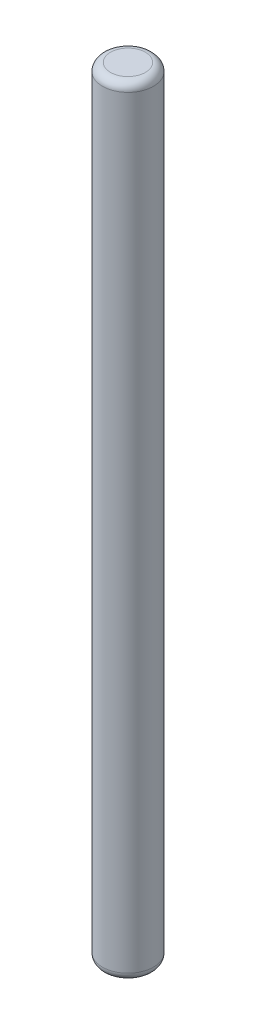
ISO-10303-21;
HEADER;
FILE_DESCRIPTION(('STEP AP214'),'2;1');
FILE_NAME('part.step','',(''),(''),'','','');
FILE_SCHEMA(('AUTOMOTIVE_DESIGN { 1 0 10303 214 1 1 1 1 }'));
ENDSEC;
DATA;
#1=APPLICATION_CONTEXT('core data for automotive mechanical design processes');
#2=APPLICATION_PROTOCOL_DEFINITION('international standard','automotive_design',2000,#1);
#3=PRODUCT_CONTEXT('',#1,'mechanical');
#4=PRODUCT('Part','Part','',(#3));
#5=PRODUCT_RELATED_PRODUCT_CATEGORY('part','',(#4));
#6=PRODUCT_DEFINITION_FORMATION('','',#4);
#7=PRODUCT_DEFINITION_CONTEXT('part definition',#1,'design');
#8=PRODUCT_DEFINITION('design','',#6,#7);
#9=PRODUCT_DEFINITION_SHAPE('','',#8);
#10=(LENGTH_UNIT() NAMED_UNIT(*) SI_UNIT(.MILLI.,.METRE.));
#11=(NAMED_UNIT(*) PLANE_ANGLE_UNIT() SI_UNIT($,.RADIAN.));
#12=(NAMED_UNIT(*) SI_UNIT($,.STERADIAN.) SOLID_ANGLE_UNIT());
#13=UNCERTAINTY_MEASURE_WITH_UNIT(LENGTH_MEASURE(1.E-05),#10,'distance_accuracy_value','');
#14=(GEOMETRIC_REPRESENTATION_CONTEXT(3) GLOBAL_UNCERTAINTY_ASSIGNED_CONTEXT((#13)) GLOBAL_UNIT_ASSIGNED_CONTEXT((#10,
#11,#12)) REPRESENTATION_CONTEXT('',''));
#15=CARTESIAN_POINT('',(0.,0.,0.));
#16=DIRECTION('',(0.,0.,1.));
#17=DIRECTION('',(1.,0.,0.));
#18=AXIS2_PLACEMENT_3D('',#15,#16,#17);
#19=CARTESIAN_POINT('',(0.,97.,0.));
#20=DIRECTION('',(0.,-1.,0.));
#21=DIRECTION('',(0.,0.,-1.));
#22=AXIS2_PLACEMENT_3D('',#19,#20,#21);
#23=CYLINDRICAL_SURFACE('',#22,3.175);
#24=CARTESIAN_POINT('',(0.,0.999999999999987,0.));
#25=DIRECTION('',(0.,1.,0.));
#26=DIRECTION('',(0.,0.,1.));
#27=AXIS2_PLACEMENT_3D('',#24,#25,#26);
#28=CIRCLE('',#27,3.175);
#29=CARTESIAN_POINT('',(0.,0.999999999999987,3.175));
#30=VERTEX_POINT('',#29);
#31=EDGE_CURVE('E85',#30,#30,#28,.T.);
#32=ORIENTED_EDGE('',*,*,#31,.T.);
#33=EDGE_LOOP('',(#32));
#34=FACE_BOUND('',#33,.T.);
#35=DIRECTION('',(0.,-1.,0.));
#36=VECTOR('',#35,1.);
#37=CARTESIAN_POINT('',(1.56290214617683,218.76851116976,-2.76368628492379));
#38=LINE('',#37,#36);
#39=CARTESIAN_POINT('',(1.56290214617683,96.,-2.76368628492379));
#40=VERTEX_POINT('',#39);
#41=CARTESIAN_POINT('',(1.56290214617683,76.,-2.76368628492379));
#42=VERTEX_POINT('',#41);
#43=EDGE_CURVE('E74',#40,#42,#38,.T.);
#44=ORIENTED_EDGE('',*,*,#43,.F.);
#45=CARTESIAN_POINT('',(0.,96.,0.));
#46=DIRECTION('',(0.,1.,0.));
#47=DIRECTION('',(0.,0.,1.));
#48=AXIS2_PLACEMENT_3D('',#45,#46,#47);
#49=CIRCLE('',#48,3.175);
#50=CARTESIAN_POINT('',(-1.61069822716502,96.,-2.73610603248622));
#51=VERTEX_POINT('',#50);
#52=EDGE_CURVE('E72',#40,#51,#49,.F.);
#53=ORIENTED_EDGE('',*,*,#52,.T.);
#54=DIRECTION('',(0.,-1.,0.));
#55=VECTOR('',#54,1.);
#56=CARTESIAN_POINT('',(-1.61069822716502,218.76851116976,-2.73610603248622));
#57=LINE('',#56,#55);
#58=CARTESIAN_POINT('',(-1.61069822716502,76.,-2.73610603248622));
#59=VERTEX_POINT('',#58);
#60=EDGE_CURVE('E67',#51,#59,#57,.T.);
#61=ORIENTED_EDGE('',*,*,#60,.T.);
#62=CARTESIAN_POINT('',(0.,76.,0.));
#63=DIRECTION('',(0.,1.,0.));
#64=DIRECTION('',(0.,0.,1.));
#65=AXIS2_PLACEMENT_3D('',#62,#63,#64);
#66=CIRCLE('',#65,3.175);
#67=EDGE_CURVE('E69',#42,#59,#66,.T.);
#68=ORIENTED_EDGE('',*,*,#67,.F.);
#69=EDGE_LOOP('',(#44,#53,#61,#68));
#70=FACE_BOUND('',#69,.T.);
#71=ADVANCED_FACE('F33',(#34,#70),#23,.T.);
#72=CARTESIAN_POINT('',(0.,97.,0.));
#73=DIRECTION('',(0.,1.,0.));
#74=DIRECTION('',(0.,0.,1.));
#75=AXIS2_PLACEMENT_3D('',#72,#73,#74);
#76=PLANE('',#75);
#77=CARTESIAN_POINT('',(0.,97.,0.));
#78=DIRECTION('',(0.,1.,0.));
#79=DIRECTION('',(0.,0.,1.));
#80=AXIS2_PLACEMENT_3D('',#77,#78,#79);
#81=CIRCLE('',#80,2.175);
#82=CARTESIAN_POINT('',(-1.10339169892407,97.,-1.874340352963));
#83=VERTEX_POINT('',#82);
#84=EDGE_CURVE('E47',#83,#83,#81,.T.);
#85=ORIENTED_EDGE('',*,*,#84,.T.);
#86=EDGE_LOOP('',(#85));
#87=FACE_BOUND('',#86,.T.);
#88=ADVANCED_FACE('F91',(#87),#76,.T.);
#89=CARTESIAN_POINT('',(0.,0.,0.));
#90=DIRECTION('',(0.,1.,0.));
#91=DIRECTION('',(0.,0.,1.));
#92=AXIS2_PLACEMENT_3D('',#89,#90,#91);
#93=PLANE('',#92);
#94=CARTESIAN_POINT('',(0.,0.,0.));
#95=DIRECTION('',(0.,1.,0.));
#96=DIRECTION('',(0.,0.,1.));
#97=AXIS2_PLACEMENT_3D('',#94,#95,#96);
#98=CIRCLE('',#97,2.175);
#99=CARTESIAN_POINT('',(0.,0.,2.175));
#100=VERTEX_POINT('',#99);
#101=EDGE_CURVE('E88',#100,#100,#98,.F.);
#102=ORIENTED_EDGE('',*,*,#101,.T.);
#103=EDGE_LOOP('',(#102));
#104=FACE_BOUND('',#103,.T.);
#105=ADVANCED_FACE('F93',(#104),#93,.F.);
#106=CARTESIAN_POINT('',(-1.61069822716502,218.76851116976,-2.73610603248622));
#107=DIRECTION('',(-0.00869019654330695,0.,-0.999962239529093));
#108=DIRECTION('',(-0.999962239529093,0.,0.00869019654330696));
#109=AXIS2_PLACEMENT_3D('',#106,#107,#108);
#110=PLANE('',#109);
#111=ORIENTED_EDGE('',*,*,#60,.F.);
#112=CARTESIAN_POINT('',(-1.61069822716502,96.,-2.73610603248622));
#113=CARTESIAN_POINT('',(-1.61075815232293,96.0294849021163,-2.73610551170515));
#114=CARTESIAN_POINT('',(-1.6080932676997,96.0589110907514,-2.7361286709508));
#115=CARTESIAN_POINT('',(-1.59782398961865,96.1166766205884,-2.73621791636563));
#116=CARTESIAN_POINT('',(-1.59025572367479,96.1450223180233,-2.73628368856776));
#117=CARTESIAN_POINT('',(-1.5706976410291,96.2000500893453,-2.73645365856811));
#118=CARTESIAN_POINT('',(-1.55871731428119,96.2267355912117,-2.73655777389365));
#119=CARTESIAN_POINT('',(-1.53102276918337,96.2781237885473,-2.73679845402192));
#120=CARTESIAN_POINT('',(-1.51530159762138,96.3028226756657,-2.73693507925172));
#121=CARTESIAN_POINT('',(-1.47183382084544,96.3622967816714,-2.73731283703951));
#122=CARTESIAN_POINT('',(-1.4420904995635,96.39561329528,-2.73757132210782));
#123=CARTESIAN_POINT('',(-1.3777120346562,96.4571068084365,-2.73813080474735));
#124=CARTESIAN_POINT('',(-1.34306574889894,96.4852717571078,-2.73843189914954));
#125=CARTESIAN_POINT('',(-1.24922951027211,96.5519991805868,-2.73924738529924));
#126=CARTESIAN_POINT('',(-1.18753452370364,96.5870108383981,-2.73978354710398));
#127=CARTESIAN_POINT('',(-1.05972236646122,96.6475175474444,-2.74089430181366));
#128=CARTESIAN_POINT('',(-0.993595916866024,96.6729918449144,-2.74146897535729));
#129=CARTESIAN_POINT('',(-0.860813441591224,96.7158525045714,-2.74262292473861));
#130=CARTESIAN_POINT('',(-0.794220386652484,96.733439431373,-2.74320165332751));
#131=CARTESIAN_POINT('',(-0.659764762961699,96.7629765515926,-2.74437014324647));
#132=CARTESIAN_POINT('',(-0.591900942811945,96.7749208480806,-2.74495991545182));
#133=CARTESIAN_POINT('',(-0.455291072627452,96.79422851411,-2.74614712690315));
#134=CARTESIAN_POINT('',(-0.386542706026737,96.8015749975899,-2.74674458628129));
#135=CARTESIAN_POINT('',(-0.248776435041069,96.8122853805757,-2.74794184746234));
#136=CARTESIAN_POINT('',(-0.179758654730772,96.815650936169,-2.74854164818697));
#137=CARTESIAN_POINT('',(-0.0311439816795456,96.8189610218363,-2.74983318767415));
#138=CARTESIAN_POINT('',(0.0484664991563582,96.8183078622401,-2.75052504452436));
#139=CARTESIAN_POINT('',(0.207549964211661,96.812073506665,-2.75190756330704));
#140=CARTESIAN_POINT('',(0.287022833158464,96.8064892676123,-2.75259822423773));
#141=CARTESIAN_POINT('',(0.445282219527761,96.7897091706527,-2.75397358134423));
#142=CARTESIAN_POINT('',(0.524069561966463,96.778521423088,-2.75465828468987));
#143=CARTESIAN_POINT('',(0.680296821743332,96.749212719485,-2.75601598155003));
#144=CARTESIAN_POINT('',(0.75773835460916,96.731100777404,-2.75668898910433));
#145=CARTESIAN_POINT('',(0.917298944069365,96.6837956613442,-2.75807565434844));
#146=CARTESIAN_POINT('',(0.999163671526081,96.6537133950292,-2.75878710178459));
#147=CARTESIAN_POINT('',(1.1559265587765,96.5791910474732,-2.76014945352854));
#148=CARTESIAN_POINT('',(1.23087551504657,96.5348685503002,-2.76080079928436));
#149=CARTESIAN_POINT('',(1.32673738231939,96.4591962048762,-2.76163388920984));
#150=CARTESIAN_POINT('',(1.3536182350172,96.4354183871771,-2.76186749792421));
#151=CARTESIAN_POINT('',(1.40402430342032,96.3844569039112,-2.76230555310678));
#152=CARTESIAN_POINT('',(1.42754766387853,96.3572713708082,-2.7625099834519));
#153=CARTESIAN_POINT('',(1.47030156729984,96.2992073555185,-2.76288153730568));
#154=CARTESIAN_POINT('',(1.48948394867026,96.2682927731143,-2.76304824226481));
#155=CARTESIAN_POINT('',(1.52182483702707,96.2035075895812,-2.76332930155395));
#156=CARTESIAN_POINT('',(1.53499993110093,96.1696454392718,-2.76344380003445));
#157=CARTESIAN_POINT('',(1.55341157517625,96.1025466826509,-2.76360380688208));
#158=CARTESIAN_POINT('',(1.55917652593272,96.0694590162651,-2.76365390732903));
#159=CARTESIAN_POINT('',(1.56281493243005,96.019327799937,-2.76368552699057));
#160=CARTESIAN_POINT('',(1.56318039711228,96.002436574028,-2.76368870307042));
#161=CARTESIAN_POINT('',(1.56220693301758,95.9686923603335,-2.76368024315666));
#162=CARTESIAN_POINT('',(1.56086690878656,95.9518394040968,-2.76366859764298));
#163=CARTESIAN_POINT('',(1.558678377845,95.9350880683884,-2.76364957816077));
#164=B_SPLINE_CURVE_WITH_KNOTS('',3,(#112,#113,#114,#115,#116,#117,#118,#119,#120,#121,#122,
#123,#124,#125,#126,#127,#128,#129,#130,#131,#132,#133,#134,#135,#136,#137,#138,#139,#140,#141,
#142,#143,#144,#145,#146,#147,#148,#149,#150,#151,#152,#153,#154,#155,#156,#157,#158,#159,#160,
#161,#162,#163),.UNSPECIFIED.,.F.,.F.,(4,2,2,2,2,2,2,2,2,2,2,2,2,2,2,2,2,2,2,2,2,2,2,2,2,4),(0.,
0.0882412054076821,0.175839542377318,0.263250553124139,0.350825324066398,0.484049936238406,
0.617582317877999,0.829199284069703,1.04127409903179,1.24759883601661,1.45413872188795,
1.66143276814876,1.86864054860544,2.10734092743921,2.34618871637002,2.58469179919615,
2.82288544877458,3.08370236924301,3.34241876015415,3.44983421962826,3.5573088056864,
3.66592295078496,3.77423535109815,3.87429463707316,3.92490339163163,3.97554466915564),.UNSPECIFIED.);
#165=EDGE_CURVE('E11',#51,#40,#164,.T.);
#166=ORIENTED_EDGE('',*,*,#165,.T.);
#167=ORIENTED_EDGE('',*,*,#43,.T.);
#168=DIRECTION('',(0.999962239529093,0.,-0.00869019654330696));
#169=VECTOR('',#168,1.);
#170=CARTESIAN_POINT('',(-1.61069822716502,76.,-2.73610603248622));
#171=LINE('',#170,#169);
#172=EDGE_CURVE('E78',#59,#42,#171,.T.);
#173=ORIENTED_EDGE('',*,*,#172,.F.);
#174=EDGE_LOOP('',(#111,#166,#167,#173));
#175=FACE_BOUND('',#174,.T.);
#176=ADVANCED_FACE('F80',(#175),#110,.T.);
#177=CARTESIAN_POINT('',(0.,76.,0.));
#178=DIRECTION('',(0.,1.,0.));
#179=DIRECTION('',(0.,0.,1.));
#180=AXIS2_PLACEMENT_3D('',#177,#178,#179);
#181=PLANE('',#180);
#182=ORIENTED_EDGE('',*,*,#172,.T.);
#183=ORIENTED_EDGE('',*,*,#67,.T.);
#184=EDGE_LOOP('',(#182,#183));
#185=FACE_BOUND('',#184,.T.);
#186=ADVANCED_FACE('F77',(#185),#181,.T.);
#187=CARTESIAN_POINT('',(0.,1.,0.));
#188=DIRECTION('',(0.,1.,0.));
#189=DIRECTION('',(0.,0.,1.));
#190=AXIS2_PLACEMENT_3D('',#187,#188,#189);
#191=TOROIDAL_SURFACE('',#190,2.175,1.);
#192=ORIENTED_EDGE('',*,*,#101,.F.);
#193=EDGE_LOOP('',(#192));
#194=FACE_BOUND('',#193,.T.);
#195=ORIENTED_EDGE('',*,*,#31,.F.);
#196=EDGE_LOOP('',(#195));
#197=FACE_BOUND('',#196,.T.);
#198=ADVANCED_FACE('F104',(#194,#197),#191,.T.);
#199=CARTESIAN_POINT('',(0.,96.,0.));
#200=DIRECTION('',(0.,1.,0.));
#201=DIRECTION('',(0.,0.,1.));
#202=AXIS2_PLACEMENT_3D('',#199,#200,#201);
#203=TOROIDAL_SURFACE('',#202,2.175,1.);
#204=ORIENTED_EDGE('',*,*,#165,.F.);
#205=ORIENTED_EDGE('',*,*,#52,.F.);
#206=EDGE_LOOP('',(#204,#205));
#207=FACE_BOUND('',#206,.T.);
#208=ORIENTED_EDGE('',*,*,#84,.F.);
#209=EDGE_LOOP('',(#208));
#210=FACE_BOUND('',#209,.T.);
#211=ADVANCED_FACE('F35',(#207,#210),#203,.T.);
#212=CLOSED_SHELL('',(#71,#88,#105,#176,#186,#198,#211));
#213=MANIFOLD_SOLID_BREP('B2',#212);
#214=ADVANCED_BREP_SHAPE_REPRESENTATION('',(#18,#213),#14);
#215=SHAPE_DEFINITION_REPRESENTATION(#9,#214);
ENDSEC;
END-ISO-10303-21;
